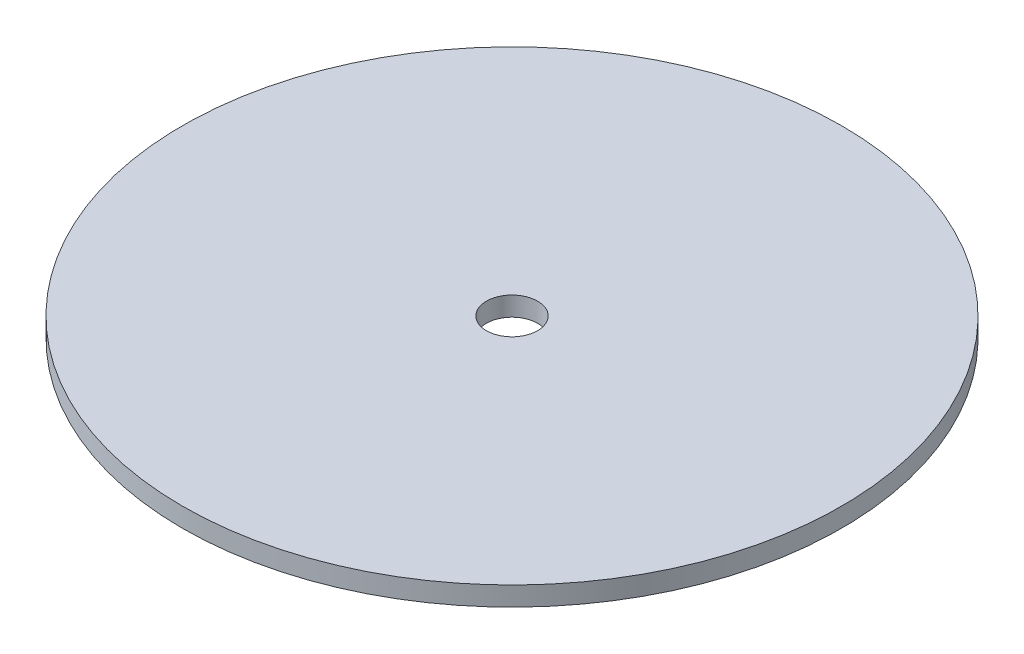
ISO-10303-21;
HEADER;
FILE_DESCRIPTION(('STEP AP214'),'2;1');
FILE_NAME('part.step','',(''),(''),'','','');
FILE_SCHEMA(('AUTOMOTIVE_DESIGN { 1 0 10303 214 1 1 1 1 }'));
ENDSEC;
DATA;
#1=APPLICATION_CONTEXT('core data for automotive mechanical design processes');
#2=APPLICATION_PROTOCOL_DEFINITION('international standard','automotive_design',2000,#1);
#3=PRODUCT_CONTEXT('',#1,'mechanical');
#4=PRODUCT('Part','Part','',(#3));
#5=PRODUCT_RELATED_PRODUCT_CATEGORY('part','',(#4));
#6=PRODUCT_DEFINITION_FORMATION('','',#4);
#7=PRODUCT_DEFINITION_CONTEXT('part definition',#1,'design');
#8=PRODUCT_DEFINITION('design','',#6,#7);
#9=PRODUCT_DEFINITION_SHAPE('','',#8);
#10=(LENGTH_UNIT() NAMED_UNIT(*) SI_UNIT(.MILLI.,.METRE.));
#11=(NAMED_UNIT(*) PLANE_ANGLE_UNIT() SI_UNIT($,.RADIAN.));
#12=(NAMED_UNIT(*) SI_UNIT($,.STERADIAN.) SOLID_ANGLE_UNIT());
#13=UNCERTAINTY_MEASURE_WITH_UNIT(LENGTH_MEASURE(1.E-05),#10,'distance_accuracy_value','');
#14=(GEOMETRIC_REPRESENTATION_CONTEXT(3) GLOBAL_UNCERTAINTY_ASSIGNED_CONTEXT((#13)) GLOBAL_UNIT_ASSIGNED_CONTEXT((#10,
#11,#12)) REPRESENTATION_CONTEXT('',''));
#15=CARTESIAN_POINT('',(0.,0.,0.));
#16=DIRECTION('',(0.,0.,1.));
#17=DIRECTION('',(1.,0.,0.));
#18=AXIS2_PLACEMENT_3D('',#15,#16,#17);
#19=CARTESIAN_POINT('',(0.,0.6,0.));
#20=DIRECTION('',(0.,1.,0.));
#21=DIRECTION('',(0.,0.,1.));
#22=AXIS2_PLACEMENT_3D('',#19,#20,#21);
#23=PLANE('',#22);
#24=CARTESIAN_POINT('',(0.,0.6,0.));
#25=DIRECTION('',(0.,1.,0.));
#26=DIRECTION('',(0.,0.,1.));
#27=AXIS2_PLACEMENT_3D('',#24,#25,#26);
#28=CIRCLE('',#27,10.3);
#29=CARTESIAN_POINT('',(0.,0.6,10.3));
#30=VERTEX_POINT('',#29);
#31=EDGE_CURVE('E10',#30,#30,#28,.T.);
#32=ORIENTED_EDGE('',*,*,#31,.T.);
#33=EDGE_LOOP('',(#32));
#34=FACE_BOUND('',#33,.T.);
#35=CARTESIAN_POINT('',(0.,0.6,0.));
#36=DIRECTION('',(0.,1.,0.));
#37=DIRECTION('',(0.,0.,1.));
#38=AXIS2_PLACEMENT_3D('',#35,#36,#37);
#39=CIRCLE('',#38,0.8);
#40=CARTESIAN_POINT('',(0.,0.6,0.8));
#41=VERTEX_POINT('',#40);
#42=EDGE_CURVE('E40',#41,#41,#39,.T.);
#43=ORIENTED_EDGE('',*,*,#42,.F.);
#44=EDGE_LOOP('',(#43));
#45=FACE_BOUND('',#44,.T.);
#46=ADVANCED_FACE('F29',(#34,#45),#23,.T.);
#47=CARTESIAN_POINT('',(0.,0.,0.));
#48=DIRECTION('',(0.,1.,0.));
#49=DIRECTION('',(0.,0.,1.));
#50=AXIS2_PLACEMENT_3D('',#47,#48,#49);
#51=PLANE('',#50);
#52=CARTESIAN_POINT('',(0.,0.,0.));
#53=DIRECTION('',(0.,1.,0.));
#54=DIRECTION('',(0.,0.,1.));
#55=AXIS2_PLACEMENT_3D('',#52,#53,#54);
#56=CIRCLE('',#55,10.3);
#57=CARTESIAN_POINT('',(0.,0.,10.3));
#58=VERTEX_POINT('',#57);
#59=EDGE_CURVE('E33',#58,#58,#56,.T.);
#60=ORIENTED_EDGE('',*,*,#59,.F.);
#61=EDGE_LOOP('',(#60));
#62=FACE_BOUND('',#61,.T.);
#63=CARTESIAN_POINT('',(0.,0.,0.));
#64=DIRECTION('',(0.,1.,0.));
#65=DIRECTION('',(0.,0.,1.));
#66=AXIS2_PLACEMENT_3D('',#63,#64,#65);
#67=CIRCLE('',#66,0.8);
#68=CARTESIAN_POINT('',(0.,0.,0.8));
#69=VERTEX_POINT('',#68);
#70=EDGE_CURVE('E42',#69,#69,#67,.T.);
#71=ORIENTED_EDGE('',*,*,#70,.T.);
#72=EDGE_LOOP('',(#71));
#73=FACE_BOUND('',#72,.T.);
#74=ADVANCED_FACE('F52',(#62,#73),#51,.F.);
#75=CARTESIAN_POINT('',(0.,0.6,0.));
#76=DIRECTION('',(0.,-1.,0.));
#77=DIRECTION('',(0.,0.,-1.));
#78=AXIS2_PLACEMENT_3D('',#75,#76,#77);
#79=CYLINDRICAL_SURFACE('',#78,10.3);
#80=ORIENTED_EDGE('',*,*,#31,.F.);
#81=EDGE_LOOP('',(#80));
#82=FACE_BOUND('',#81,.T.);
#83=ORIENTED_EDGE('',*,*,#59,.T.);
#84=EDGE_LOOP('',(#83));
#85=FACE_BOUND('',#84,.T.);
#86=ADVANCED_FACE('F31',(#82,#85),#79,.T.);
#87=CARTESIAN_POINT('',(0.,0.6,0.));
#88=DIRECTION('',(0.,-1.,0.));
#89=DIRECTION('',(0.,0.,-1.));
#90=AXIS2_PLACEMENT_3D('',#87,#88,#89);
#91=CYLINDRICAL_SURFACE('',#90,0.8);
#92=ORIENTED_EDGE('',*,*,#42,.T.);
#93=EDGE_LOOP('',(#92));
#94=FACE_BOUND('',#93,.T.);
#95=ORIENTED_EDGE('',*,*,#70,.F.);
#96=EDGE_LOOP('',(#95));
#97=FACE_BOUND('',#96,.T.);
#98=ADVANCED_FACE('F48',(#94,#97),#91,.F.);
#99=CLOSED_SHELL('',(#46,#74,#86,#98));
#100=MANIFOLD_SOLID_BREP('B2',#99);
#101=ADVANCED_BREP_SHAPE_REPRESENTATION('',(#18,#100),#14);
#102=SHAPE_DEFINITION_REPRESENTATION(#9,#101);
ENDSEC;
END-ISO-10303-21;
